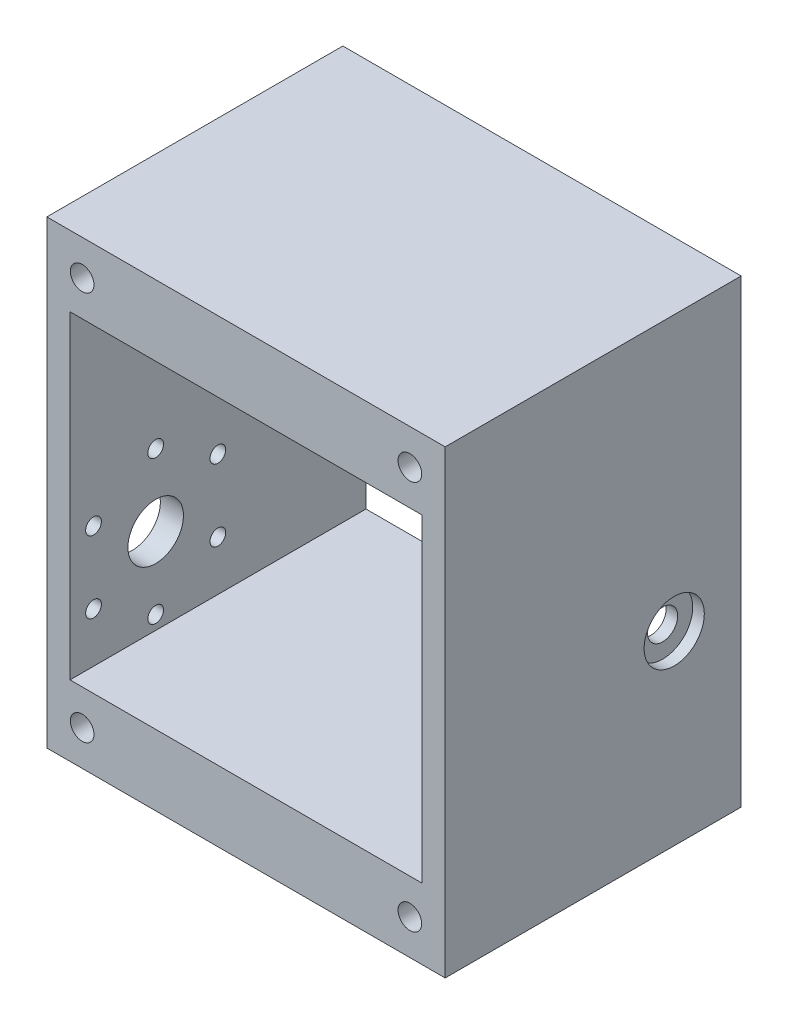
ISO-10303-21;
HEADER;
FILE_DESCRIPTION(('STEP AP214'),'2;1');
FILE_NAME('part.step','',(''),(''),'','','');
FILE_SCHEMA(('AUTOMOTIVE_DESIGN { 1 0 10303 214 1 1 1 1 }'));
ENDSEC;
DATA;
#1=APPLICATION_CONTEXT('core data for automotive mechanical design processes');
#2=APPLICATION_PROTOCOL_DEFINITION('international standard','automotive_design',2000,#1);
#3=PRODUCT_CONTEXT('',#1,'mechanical');
#4=PRODUCT('Part','Part','',(#3));
#5=PRODUCT_RELATED_PRODUCT_CATEGORY('part','',(#4));
#6=PRODUCT_DEFINITION_FORMATION('','',#4);
#7=PRODUCT_DEFINITION_CONTEXT('part definition',#1,'design');
#8=PRODUCT_DEFINITION('design','',#6,#7);
#9=PRODUCT_DEFINITION_SHAPE('','',#8);
#10=(LENGTH_UNIT() NAMED_UNIT(*) SI_UNIT(.MILLI.,.METRE.));
#11=(NAMED_UNIT(*) PLANE_ANGLE_UNIT() SI_UNIT($,.RADIAN.));
#12=(NAMED_UNIT(*) SI_UNIT($,.STERADIAN.) SOLID_ANGLE_UNIT());
#13=UNCERTAINTY_MEASURE_WITH_UNIT(LENGTH_MEASURE(1.E-05),#10,'distance_accuracy_value','');
#14=(GEOMETRIC_REPRESENTATION_CONTEXT(3) GLOBAL_UNCERTAINTY_ASSIGNED_CONTEXT((#13)) GLOBAL_UNIT_ASSIGNED_CONTEXT((#10,
#11,#12)) REPRESENTATION_CONTEXT('',''));
#15=CARTESIAN_POINT('',(0.,0.,0.));
#16=DIRECTION('',(0.,0.,1.));
#17=DIRECTION('',(1.,0.,0.));
#18=AXIS2_PLACEMENT_3D('',#15,#16,#17);
#19=CARTESIAN_POINT('',(42.999999852,-9.52499999999999,14.450199954));
#20=DIRECTION('',(1.,0.,0.));
#21=DIRECTION('',(0.,0.,-1.));
#22=AXIS2_PLACEMENT_3D('',#19,#20,#21);
#23=CYLINDRICAL_SURFACE('',#22,3.24999999999999);
#24=CARTESIAN_POINT('',(37.999999946,-9.52499999999999,14.450199954));
#25=DIRECTION('',(1.,0.,0.));
#26=DIRECTION('',(0.,0.,-1.));
#27=AXIS2_PLACEMENT_3D('',#24,#25,#26);
#28=CIRCLE('',#27,3.24999999999999);
#29=CARTESIAN_POINT('',(37.999999946,-9.52499999999999,11.200199954));
#30=VERTEX_POINT('',#29);
#31=EDGE_CURVE('E123',#30,#30,#28,.T.);
#32=ORIENTED_EDGE('',*,*,#31,.F.);
#33=EDGE_LOOP('',(#32));
#34=FACE_BOUND('',#33,.T.);
#35=CARTESIAN_POINT('',(40.499999899,-9.52499999999999,14.450199954));
#36=DIRECTION('',(1.,0.,0.));
#37=DIRECTION('',(0.,0.,-1.));
#38=AXIS2_PLACEMENT_3D('',#35,#36,#37);
#39=CIRCLE('',#38,3.24999999999999);
#40=CARTESIAN_POINT('',(40.499999899,-9.52499999999999,11.200199954));
#41=VERTEX_POINT('',#40);
#42=EDGE_CURVE('E37',#41,#41,#39,.F.);
#43=ORIENTED_EDGE('',*,*,#42,.F.);
#44=EDGE_LOOP('',(#43));
#45=FACE_BOUND('',#44,.T.);
#46=ADVANCED_FACE('F33',(#34,#45),#23,.F.);
#47=CARTESIAN_POINT('',(-42.999999852,-49.657,63.903125051));
#48=DIRECTION('',(1.,0.,0.));
#49=DIRECTION('',(0.,0.,-1.));
#50=AXIS2_PLACEMENT_3D('',#47,#48,#49);
#51=PLANE('',#50);
#52=DIRECTION('',(0.,-1.,0.));
#53=VECTOR('',#52,1.);
#54=CARTESIAN_POINT('',(-42.999999852,-49.657,0.));
#55=LINE('',#54,#53);
#56=CARTESIAN_POINT('',(-42.999999852,49.657,0.));
#57=VERTEX_POINT('',#56);
#58=CARTESIAN_POINT('',(-42.999999852,-49.657,0.));
#59=VERTEX_POINT('',#58);
#60=EDGE_CURVE('E154',#57,#59,#55,.T.);
#61=ORIENTED_EDGE('',*,*,#60,.T.);
#62=DIRECTION('',(0.,0.,-1.));
#63=VECTOR('',#62,1.);
#64=CARTESIAN_POINT('',(-42.999999852,-49.657,63.903125051));
#65=LINE('',#64,#63);
#66=CARTESIAN_POINT('',(-42.999999852,-49.657,63.903125051));
#67=VERTEX_POINT('',#66);
#68=EDGE_CURVE('E159',#67,#59,#65,.T.);
#69=ORIENTED_EDGE('',*,*,#68,.F.);
#70=DIRECTION('',(0.,-1.,0.));
#71=VECTOR('',#70,1.);
#72=CARTESIAN_POINT('',(-42.999999852,-49.657,63.903125051));
#73=LINE('',#72,#71);
#74=CARTESIAN_POINT('',(-42.999999852,49.657,63.903125051));
#75=VERTEX_POINT('',#74);
#76=EDGE_CURVE('E145',#75,#67,#73,.T.);
#77=ORIENTED_EDGE('',*,*,#76,.F.);
#78=DIRECTION('',(0.,0.,-1.));
#79=VECTOR('',#78,1.);
#80=CARTESIAN_POINT('',(-42.999999852,49.657,63.903125051));
#81=LINE('',#80,#79);
#82=EDGE_CURVE('E42',#75,#57,#81,.T.);
#83=ORIENTED_EDGE('',*,*,#82,.T.);
#84=EDGE_LOOP('',(#61,#69,#77,#83));
#85=FACE_BOUND('',#84,.T.);
#86=CARTESIAN_POINT('',(-42.999999852,-15.917000043,45.403125094));
#87=DIRECTION('',(-1.,0.,0.));
#88=DIRECTION('',(0.,0.,1.));
#89=AXIS2_PLACEMENT_3D('',#86,#87,#88);
#90=CIRCLE('',#89,6.);
#91=CARTESIAN_POINT('',(-42.999999852,-15.917000043,51.403125094));
#92=VERTEX_POINT('',#91);
#93=EDGE_CURVE('E299',#92,#92,#90,.T.);
#94=ORIENTED_EDGE('',*,*,#93,.F.);
#95=EDGE_LOOP('',(#94));
#96=FACE_BOUND('',#95,.T.);
#97=CARTESIAN_POINT('',(-42.999999852,-8.167000049,31.9797313457335));
#98=DIRECTION('',(-1.,0.,0.));
#99=DIRECTION('',(0.,0.,1.));
#100=AXIS2_PLACEMENT_3D('',#97,#98,#99);
#101=CIRCLE('',#100,3.15);
#102=CARTESIAN_POINT('',(-42.999999852,-8.167000049,35.1297313457335));
#103=VERTEX_POINT('',#102);
#104=EDGE_CURVE('E290',#103,#103,#101,.T.);
#105=ORIENTED_EDGE('',*,*,#104,.F.);
#106=EDGE_LOOP('',(#105));
#107=FACE_BOUND('',#106,.T.);
#108=CARTESIAN_POINT('',(-42.999999852,-23.667000037,31.9797313457335));
#109=DIRECTION('',(-1.,0.,0.));
#110=DIRECTION('',(0.,0.,1.));
#111=AXIS2_PLACEMENT_3D('',#108,#109,#110);
#112=CIRCLE('',#111,3.15);
#113=CARTESIAN_POINT('',(-42.999999852,-23.667000037,35.1297313457335));
#114=VERTEX_POINT('',#113);
#115=EDGE_CURVE('E281',#114,#114,#112,.T.);
#116=ORIENTED_EDGE('',*,*,#115,.F.);
#117=EDGE_LOOP('',(#116));
#118=FACE_BOUND('',#117,.T.);
#119=CARTESIAN_POINT('',(-42.999999852,-31.417000031,45.403125094));
#120=DIRECTION('',(-1.,0.,0.));
#121=DIRECTION('',(0.,0.,1.));
#122=AXIS2_PLACEMENT_3D('',#119,#120,#121);
#123=CIRCLE('',#122,3.15);
#124=CARTESIAN_POINT('',(-42.999999852,-31.417000031,48.553125094));
#125=VERTEX_POINT('',#124);
#126=EDGE_CURVE('E272',#125,#125,#123,.T.);
#127=ORIENTED_EDGE('',*,*,#126,.F.);
#128=EDGE_LOOP('',(#127));
#129=FACE_BOUND('',#128,.T.);
#130=CARTESIAN_POINT('',(-42.999999852,-23.667000037,58.8265188422665));
#131=DIRECTION('',(-1.,0.,0.));
#132=DIRECTION('',(0.,0.,1.));
#133=AXIS2_PLACEMENT_3D('',#130,#131,#132);
#134=CIRCLE('',#133,3.15);
#135=CARTESIAN_POINT('',(-42.999999852,-23.667000037,61.9765188422665));
#136=VERTEX_POINT('',#135);
#137=EDGE_CURVE('E263',#136,#136,#134,.T.);
#138=ORIENTED_EDGE('',*,*,#137,.F.);
#139=EDGE_LOOP('',(#138));
#140=FACE_BOUND('',#139,.T.);
#141=CARTESIAN_POINT('',(-42.999999852,-8.167000049,58.8265188422665));
#142=DIRECTION('',(-1.,0.,0.));
#143=DIRECTION('',(0.,0.,1.));
#144=AXIS2_PLACEMENT_3D('',#141,#142,#143);
#145=CIRCLE('',#144,3.15);
#146=CARTESIAN_POINT('',(-42.999999852,-8.167000049,61.9765188422665));
#147=VERTEX_POINT('',#146);
#148=EDGE_CURVE('E254',#147,#147,#145,.T.);
#149=ORIENTED_EDGE('',*,*,#148,.F.);
#150=EDGE_LOOP('',(#149));
#151=FACE_BOUND('',#150,.T.);
#152=CARTESIAN_POINT('',(-42.999999852,-0.417000055000004,45.403125094));
#153=DIRECTION('',(-1.,0.,0.));
#154=DIRECTION('',(0.,0.,1.));
#155=AXIS2_PLACEMENT_3D('',#152,#153,#154);
#156=CIRCLE('',#155,3.15);
#157=CARTESIAN_POINT('',(-42.999999852,-0.417000055000004,48.553125094));
#158=VERTEX_POINT('',#157);
#159=EDGE_CURVE('E239',#158,#158,#156,.T.);
#160=ORIENTED_EDGE('',*,*,#159,.F.);
#161=EDGE_LOOP('',(#160));
#162=FACE_BOUND('',#161,.T.);
#163=ADVANCED_FACE('F167',(#85,#96,#107,#118,#129,#140,#151,#162),#51,.F.);
#164=CARTESIAN_POINT('',(42.999999852,-49.657,63.903125051));
#165=DIRECTION('',(-1.,0.,0.));
#166=DIRECTION('',(0.,0.,1.));
#167=AXIS2_PLACEMENT_3D('',#164,#165,#166);
#168=PLANE('',#167);
#169=CARTESIAN_POINT('',(42.999999852,-9.52499999999999,14.450199954));
#170=DIRECTION('',(1.,0.,0.));
#171=DIRECTION('',(0.,0.,-1.));
#172=AXIS2_PLACEMENT_3D('',#169,#170,#171);
#173=CIRCLE('',#172,6.499999954);
#174=CARTESIAN_POINT('',(42.999999852,-9.52499999999999,7.9502));
#175=VERTEX_POINT('',#174);
#176=EDGE_CURVE('E520',#175,#175,#173,.T.);
#177=ORIENTED_EDGE('',*,*,#176,.F.);
#178=EDGE_LOOP('',(#177));
#179=FACE_BOUND('',#178,.T.);
#180=DIRECTION('',(0.,1.,0.));
#181=VECTOR('',#180,1.);
#182=CARTESIAN_POINT('',(42.999999852,-49.657,0.));
#183=LINE('',#182,#181);
#184=CARTESIAN_POINT('',(42.999999852,-49.657,0.));
#185=VERTEX_POINT('',#184);
#186=CARTESIAN_POINT('',(42.999999852,49.657,0.));
#187=VERTEX_POINT('',#186);
#188=EDGE_CURVE('E135',#185,#187,#183,.T.);
#189=ORIENTED_EDGE('',*,*,#188,.T.);
#190=DIRECTION('',(0.,0.,-1.));
#191=VECTOR('',#190,1.);
#192=CARTESIAN_POINT('',(42.999999852,49.657,63.903125051));
#193=LINE('',#192,#191);
#194=CARTESIAN_POINT('',(42.999999852,49.657,63.903125051));
#195=VERTEX_POINT('',#194);
#196=EDGE_CURVE('E11',#195,#187,#193,.T.);
#197=ORIENTED_EDGE('',*,*,#196,.F.);
#198=DIRECTION('',(0.,1.,0.));
#199=VECTOR('',#198,1.);
#200=CARTESIAN_POINT('',(42.999999852,-49.657,63.903125051));
#201=LINE('',#200,#199);
#202=CARTESIAN_POINT('',(42.999999852,-49.657,63.903125051));
#203=VERTEX_POINT('',#202);
#204=EDGE_CURVE('E139',#203,#195,#201,.T.);
#205=ORIENTED_EDGE('',*,*,#204,.F.);
#206=DIRECTION('',(0.,0.,-1.));
#207=VECTOR('',#206,1.);
#208=CARTESIAN_POINT('',(42.999999852,-49.657,63.903125051));
#209=LINE('',#208,#207);
#210=EDGE_CURVE('E149',#203,#185,#209,.T.);
#211=ORIENTED_EDGE('',*,*,#210,.T.);
#212=EDGE_LOOP('',(#189,#197,#205,#211));
#213=FACE_BOUND('',#212,.T.);
#214=ADVANCED_FACE('F35',(#179,#213),#168,.F.);
#215=CARTESIAN_POINT('',(-42.999999852,49.657,63.903125051));
#216=DIRECTION('',(0.,-1.,0.));
#217=DIRECTION('',(0.,0.,-1.));
#218=AXIS2_PLACEMENT_3D('',#215,#216,#217);
#219=PLANE('',#218);
#220=DIRECTION('',(-1.,0.,0.));
#221=VECTOR('',#220,1.);
#222=CARTESIAN_POINT('',(-42.999999852,49.657,0.));
#223=LINE('',#222,#221);
#224=EDGE_CURVE('E152',#187,#57,#223,.T.);
#225=ORIENTED_EDGE('',*,*,#224,.T.);
#226=ORIENTED_EDGE('',*,*,#82,.F.);
#227=DIRECTION('',(-1.,0.,0.));
#228=VECTOR('',#227,1.);
#229=CARTESIAN_POINT('',(-42.999999852,49.657,63.903125051));
#230=LINE('',#229,#228);
#231=EDGE_CURVE('E142',#195,#75,#230,.T.);
#232=ORIENTED_EDGE('',*,*,#231,.F.);
#233=ORIENTED_EDGE('',*,*,#196,.T.);
#234=EDGE_LOOP('',(#225,#226,#232,#233));
#235=FACE_BOUND('',#234,.T.);
#236=ADVANCED_FACE('F182',(#235),#219,.F.);
#237=CARTESIAN_POINT('',(-42.999999852,-49.657,63.903125051));
#238=DIRECTION('',(0.,1.,0.));
#239=DIRECTION('',(0.,0.,1.));
#240=AXIS2_PLACEMENT_3D('',#237,#238,#239);
#241=PLANE('',#240);
#242=DIRECTION('',(1.,0.,0.));
#243=VECTOR('',#242,1.);
#244=CARTESIAN_POINT('',(-42.999999852,-49.657,0.));
#245=LINE('',#244,#243);
#246=EDGE_CURVE('E143',#59,#185,#245,.T.);
#247=ORIENTED_EDGE('',*,*,#246,.T.);
#248=ORIENTED_EDGE('',*,*,#210,.F.);
#249=DIRECTION('',(1.,0.,0.));
#250=VECTOR('',#249,1.);
#251=CARTESIAN_POINT('',(-42.999999852,-49.657,63.903125051));
#252=LINE('',#251,#250);
#253=EDGE_CURVE('E147',#67,#203,#252,.T.);
#254=ORIENTED_EDGE('',*,*,#253,.F.);
#255=ORIENTED_EDGE('',*,*,#68,.T.);
#256=EDGE_LOOP('',(#247,#248,#254,#255));
#257=FACE_BOUND('',#256,.T.);
#258=ADVANCED_FACE('F175',(#257),#241,.F.);
#259=CARTESIAN_POINT('',(0.,0.,63.903125051));
#260=DIRECTION('',(0.,0.,-1.));
#261=DIRECTION('',(-1.,0.,0.));
#262=AXIS2_PLACEMENT_3D('',#259,#260,#261);
#263=PLANE('',#262);
#264=CARTESIAN_POINT('',(-35.379999852,42.037,63.903125051));
#265=DIRECTION('',(0.,0.,1.));
#266=DIRECTION('',(1.,0.,0.));
#267=AXIS2_PLACEMENT_3D('',#264,#265,#266);
#268=CIRCLE('',#267,2.55269999999999);
#269=CARTESIAN_POINT('',(-32.827299852,42.037,63.903125051));
#270=VERTEX_POINT('',#269);
#271=EDGE_CURVE('E524',#270,#270,#268,.T.);
#272=ORIENTED_EDGE('',*,*,#271,.F.);
#273=EDGE_LOOP('',(#272));
#274=FACE_BOUND('',#273,.T.);
#275=CARTESIAN_POINT('',(35.379999852,42.037,63.903125051));
#276=DIRECTION('',(0.,0.,1.));
#277=DIRECTION('',(1.,0.,0.));
#278=AXIS2_PLACEMENT_3D('',#275,#276,#277);
#279=CIRCLE('',#278,2.55269999999999);
#280=CARTESIAN_POINT('',(37.932699852,42.037,63.903125051));
#281=VERTEX_POINT('',#280);
#282=EDGE_CURVE('E528',#281,#281,#279,.T.);
#283=ORIENTED_EDGE('',*,*,#282,.F.);
#284=EDGE_LOOP('',(#283));
#285=FACE_BOUND('',#284,.T.);
#286=CARTESIAN_POINT('',(-35.379999852,-42.037,63.903125051));
#287=DIRECTION('',(0.,0.,1.));
#288=DIRECTION('',(1.,0.,0.));
#289=AXIS2_PLACEMENT_3D('',#286,#287,#288);
#290=CIRCLE('',#289,2.55269999999999);
#291=CARTESIAN_POINT('',(-32.827299852,-42.037,63.903125051));
#292=VERTEX_POINT('',#291);
#293=EDGE_CURVE('E532',#292,#292,#290,.T.);
#294=ORIENTED_EDGE('',*,*,#293,.F.);
#295=EDGE_LOOP('',(#294));
#296=FACE_BOUND('',#295,.T.);
#297=CARTESIAN_POINT('',(35.379999852,-42.037,63.903125051));
#298=DIRECTION('',(0.,0.,1.));
#299=DIRECTION('',(1.,0.,0.));
#300=AXIS2_PLACEMENT_3D('',#297,#298,#299);
#301=CIRCLE('',#300,2.55269999999999);
#302=CARTESIAN_POINT('',(37.932699852,-42.037,63.903125051));
#303=VERTEX_POINT('',#302);
#304=EDGE_CURVE('E240',#303,#303,#301,.T.);
#305=ORIENTED_EDGE('',*,*,#304,.F.);
#306=EDGE_LOOP('',(#305));
#307=FACE_BOUND('',#306,.T.);
#308=DIRECTION('',(-1.,0.,0.));
#309=VECTOR('',#308,1.);
#310=CARTESIAN_POINT('',(-37.999999946,34.417,63.903125051));
#311=LINE('',#310,#309);
#312=CARTESIAN_POINT('',(37.999999946,34.417,63.903125051));
#313=VERTEX_POINT('',#312);
#314=CARTESIAN_POINT('',(-37.999999946,34.417,63.903125051));
#315=VERTEX_POINT('',#314);
#316=EDGE_CURVE('E129',#313,#315,#311,.T.);
#317=ORIENTED_EDGE('',*,*,#316,.F.);
#318=DIRECTION('',(0.,1.,0.));
#319=VECTOR('',#318,1.);
#320=CARTESIAN_POINT('',(37.999999946,-34.417,63.903125051));
#321=LINE('',#320,#319);
#322=CARTESIAN_POINT('',(37.999999946,-34.417,63.903125051));
#323=VERTEX_POINT('',#322);
#324=EDGE_CURVE('E49',#323,#313,#321,.T.);
#325=ORIENTED_EDGE('',*,*,#324,.F.);
#326=DIRECTION('',(1.,0.,0.));
#327=VECTOR('',#326,1.);
#328=CARTESIAN_POINT('',(-37.999999946,-34.417,63.903125051));
#329=LINE('',#328,#327);
#330=CARTESIAN_POINT('',(-37.999999946,-34.417,63.903125051));
#331=VERTEX_POINT('',#330);
#332=EDGE_CURVE('E117',#331,#323,#329,.T.);
#333=ORIENTED_EDGE('',*,*,#332,.F.);
#334=DIRECTION('',(0.,-1.,0.));
#335=VECTOR('',#334,1.);
#336=CARTESIAN_POINT('',(-37.999999946,-34.417,63.903125051));
#337=LINE('',#336,#335);
#338=EDGE_CURVE('E120',#315,#331,#337,.T.);
#339=ORIENTED_EDGE('',*,*,#338,.F.);
#340=EDGE_LOOP('',(#317,#325,#333,#339));
#341=FACE_BOUND('',#340,.T.);
#342=ORIENTED_EDGE('',*,*,#204,.T.);
#343=ORIENTED_EDGE('',*,*,#231,.T.);
#344=ORIENTED_EDGE('',*,*,#76,.T.);
#345=ORIENTED_EDGE('',*,*,#253,.T.);
#346=EDGE_LOOP('',(#342,#343,#344,#345));
#347=FACE_BOUND('',#346,.T.);
#348=ADVANCED_FACE('F181',(#274,#285,#296,#307,#341,#347),#263,.F.);
#349=CARTESIAN_POINT('',(0.,0.,0.));
#350=DIRECTION('',(0.,0.,-1.));
#351=DIRECTION('',(-1.,0.,0.));
#352=AXIS2_PLACEMENT_3D('',#349,#350,#351);
#353=PLANE('',#352);
#354=CARTESIAN_POINT('',(-35.379999852,42.037,0.));
#355=DIRECTION('',(0.,0.,1.));
#356=DIRECTION('',(1.,0.,0.));
#357=AXIS2_PLACEMENT_3D('',#354,#355,#356);
#358=CIRCLE('',#357,2.55269999999998);
#359=CARTESIAN_POINT('',(-32.827299852,42.037,0.));
#360=VERTEX_POINT('',#359);
#361=EDGE_CURVE('E226',#360,#360,#358,.T.);
#362=ORIENTED_EDGE('',*,*,#361,.T.);
#363=EDGE_LOOP('',(#362));
#364=FACE_BOUND('',#363,.T.);
#365=CARTESIAN_POINT('',(35.379999852,42.037,0.));
#366=DIRECTION('',(0.,0.,1.));
#367=DIRECTION('',(1.,0.,0.));
#368=AXIS2_PLACEMENT_3D('',#365,#366,#367);
#369=CIRCLE('',#368,2.55269999999998);
#370=CARTESIAN_POINT('',(37.932699852,42.037,0.));
#371=VERTEX_POINT('',#370);
#372=EDGE_CURVE('E230',#371,#371,#369,.T.);
#373=ORIENTED_EDGE('',*,*,#372,.T.);
#374=EDGE_LOOP('',(#373));
#375=FACE_BOUND('',#374,.T.);
#376=CARTESIAN_POINT('',(-35.379999852,-42.037,0.));
#377=DIRECTION('',(0.,0.,1.));
#378=DIRECTION('',(1.,0.,0.));
#379=AXIS2_PLACEMENT_3D('',#376,#377,#378);
#380=CIRCLE('',#379,2.55269999999998);
#381=CARTESIAN_POINT('',(-32.827299852,-42.037,0.));
#382=VERTEX_POINT('',#381);
#383=EDGE_CURVE('E234',#382,#382,#380,.T.);
#384=ORIENTED_EDGE('',*,*,#383,.T.);
#385=EDGE_LOOP('',(#384));
#386=FACE_BOUND('',#385,.T.);
#387=CARTESIAN_POINT('',(35.379999852,-42.037,0.));
#388=DIRECTION('',(0.,0.,1.));
#389=DIRECTION('',(1.,0.,0.));
#390=AXIS2_PLACEMENT_3D('',#387,#388,#389);
#391=CIRCLE('',#390,2.55269999999998);
#392=CARTESIAN_POINT('',(37.932699852,-42.037,0.));
#393=VERTEX_POINT('',#392);
#394=EDGE_CURVE('E237',#393,#393,#391,.T.);
#395=ORIENTED_EDGE('',*,*,#394,.T.);
#396=EDGE_LOOP('',(#395));
#397=FACE_BOUND('',#396,.T.);
#398=DIRECTION('',(0.,1.,0.));
#399=VECTOR('',#398,1.);
#400=CARTESIAN_POINT('',(37.999999946,-34.417,0.));
#401=LINE('',#400,#399);
#402=CARTESIAN_POINT('',(37.999999946,-34.417,0.));
#403=VERTEX_POINT('',#402);
#404=CARTESIAN_POINT('',(37.999999946,34.417,0.));
#405=VERTEX_POINT('',#404);
#406=EDGE_CURVE('E101',#403,#405,#401,.T.);
#407=ORIENTED_EDGE('',*,*,#406,.T.);
#408=DIRECTION('',(-1.,0.,0.));
#409=VECTOR('',#408,1.);
#410=CARTESIAN_POINT('',(-37.999999946,34.417,0.));
#411=LINE('',#410,#409);
#412=CARTESIAN_POINT('',(-37.999999946,34.417,0.));
#413=VERTEX_POINT('',#412);
#414=EDGE_CURVE('E110',#405,#413,#411,.T.);
#415=ORIENTED_EDGE('',*,*,#414,.T.);
#416=DIRECTION('',(0.,-1.,0.));
#417=VECTOR('',#416,1.);
#418=CARTESIAN_POINT('',(-37.999999946,-34.417,0.));
#419=LINE('',#418,#417);
#420=CARTESIAN_POINT('',(-37.999999946,-34.417,0.));
#421=VERTEX_POINT('',#420);
#422=EDGE_CURVE('E57',#413,#421,#419,.T.);
#423=ORIENTED_EDGE('',*,*,#422,.T.);
#424=DIRECTION('',(1.,0.,0.));
#425=VECTOR('',#424,1.);
#426=CARTESIAN_POINT('',(-37.999999946,-34.417,0.));
#427=LINE('',#426,#425);
#428=EDGE_CURVE('E107',#421,#403,#427,.T.);
#429=ORIENTED_EDGE('',*,*,#428,.T.);
#430=EDGE_LOOP('',(#407,#415,#423,#429));
#431=FACE_BOUND('',#430,.T.);
#432=ORIENTED_EDGE('',*,*,#188,.F.);
#433=ORIENTED_EDGE('',*,*,#246,.F.);
#434=ORIENTED_EDGE('',*,*,#60,.F.);
#435=ORIENTED_EDGE('',*,*,#224,.F.);
#436=EDGE_LOOP('',(#432,#433,#434,#435));
#437=FACE_BOUND('',#436,.T.);
#438=ADVANCED_FACE('F114',(#364,#375,#386,#397,#431,#437),#353,.T.);
#439=CARTESIAN_POINT('',(37.999999946,-34.417,0.));
#440=DIRECTION('',(1.,0.,0.));
#441=DIRECTION('',(0.,0.,-1.));
#442=AXIS2_PLACEMENT_3D('',#439,#440,#441);
#443=PLANE('',#442);
#444=ORIENTED_EDGE('',*,*,#31,.T.);
#445=EDGE_LOOP('',(#444));
#446=FACE_BOUND('',#445,.T.);
#447=ORIENTED_EDGE('',*,*,#324,.T.);
#448=DIRECTION('',(0.,0.,1.));
#449=VECTOR('',#448,1.);
#450=CARTESIAN_POINT('',(37.999999946,34.417,0.));
#451=LINE('',#450,#449);
#452=EDGE_CURVE('E97',#405,#313,#451,.T.);
#453=ORIENTED_EDGE('',*,*,#452,.F.);
#454=ORIENTED_EDGE('',*,*,#406,.F.);
#455=DIRECTION('',(0.,0.,1.));
#456=VECTOR('',#455,1.);
#457=CARTESIAN_POINT('',(37.999999946,-34.417,0.));
#458=LINE('',#457,#456);
#459=EDGE_CURVE('E133',#403,#323,#458,.T.);
#460=ORIENTED_EDGE('',*,*,#459,.T.);
#461=EDGE_LOOP('',(#447,#453,#454,#460));
#462=FACE_BOUND('',#461,.T.);
#463=ADVANCED_FACE('F99',(#446,#462),#443,.F.);
#464=CARTESIAN_POINT('',(-37.999999946,-34.417,0.));
#465=DIRECTION('',(0.,-1.,0.));
#466=DIRECTION('',(0.,0.,-1.));
#467=AXIS2_PLACEMENT_3D('',#464,#465,#466);
#468=PLANE('',#467);
#469=ORIENTED_EDGE('',*,*,#332,.T.);
#470=ORIENTED_EDGE('',*,*,#459,.F.);
#471=ORIENTED_EDGE('',*,*,#428,.F.);
#472=DIRECTION('',(0.,0.,1.));
#473=VECTOR('',#472,1.);
#474=CARTESIAN_POINT('',(-37.999999946,-34.417,0.));
#475=LINE('',#474,#473);
#476=EDGE_CURVE('E136',#421,#331,#475,.T.);
#477=ORIENTED_EDGE('',*,*,#476,.T.);
#478=EDGE_LOOP('',(#469,#470,#471,#477));
#479=FACE_BOUND('',#478,.T.);
#480=ADVANCED_FACE('F203',(#479),#468,.F.);
#481=CARTESIAN_POINT('',(-37.999999946,-34.417,0.));
#482=DIRECTION('',(-1.,0.,0.));
#483=DIRECTION('',(0.,0.,1.));
#484=AXIS2_PLACEMENT_3D('',#481,#482,#483);
#485=PLANE('',#484);
#486=CARTESIAN_POINT('',(-37.999999946,-0.417000055000004,45.403125094));
#487=DIRECTION('',(-1.,0.,0.));
#488=DIRECTION('',(0.,0.,1.));
#489=AXIS2_PLACEMENT_3D('',#486,#487,#488);
#490=CIRCLE('',#489,1.7);
#491=CARTESIAN_POINT('',(-37.999999946,-0.417000055000004,47.103125094));
#492=VERTEX_POINT('',#491);
#493=EDGE_CURVE('E251',#492,#492,#490,.T.);
#494=ORIENTED_EDGE('',*,*,#493,.T.);
#495=EDGE_LOOP('',(#494));
#496=FACE_BOUND('',#495,.T.);
#497=CARTESIAN_POINT('',(-37.999999946,-8.167000049,58.8265188422665));
#498=DIRECTION('',(-1.,0.,0.));
#499=DIRECTION('',(0.,0.,1.));
#500=AXIS2_PLACEMENT_3D('',#497,#498,#499);
#501=CIRCLE('',#500,1.7);
#502=CARTESIAN_POINT('',(-37.999999946,-8.167000049,60.5265188422665));
#503=VERTEX_POINT('',#502);
#504=EDGE_CURVE('E260',#503,#503,#501,.T.);
#505=ORIENTED_EDGE('',*,*,#504,.T.);
#506=EDGE_LOOP('',(#505));
#507=FACE_BOUND('',#506,.T.);
#508=CARTESIAN_POINT('',(-37.999999946,-23.667000037,58.8265188422665));
#509=DIRECTION('',(-1.,0.,0.));
#510=DIRECTION('',(0.,0.,1.));
#511=AXIS2_PLACEMENT_3D('',#508,#509,#510);
#512=CIRCLE('',#511,1.7);
#513=CARTESIAN_POINT('',(-37.999999946,-23.667000037,60.5265188422665));
#514=VERTEX_POINT('',#513);
#515=EDGE_CURVE('E269',#514,#514,#512,.T.);
#516=ORIENTED_EDGE('',*,*,#515,.T.);
#517=EDGE_LOOP('',(#516));
#518=FACE_BOUND('',#517,.T.);
#519=CARTESIAN_POINT('',(-37.999999946,-31.417000031,45.403125094));
#520=DIRECTION('',(-1.,0.,0.));
#521=DIRECTION('',(0.,0.,1.));
#522=AXIS2_PLACEMENT_3D('',#519,#520,#521);
#523=CIRCLE('',#522,1.7);
#524=CARTESIAN_POINT('',(-37.999999946,-31.417000031,47.103125094));
#525=VERTEX_POINT('',#524);
#526=EDGE_CURVE('E278',#525,#525,#523,.T.);
#527=ORIENTED_EDGE('',*,*,#526,.T.);
#528=EDGE_LOOP('',(#527));
#529=FACE_BOUND('',#528,.T.);
#530=CARTESIAN_POINT('',(-37.999999946,-23.667000037,31.9797313457335));
#531=DIRECTION('',(-1.,0.,0.));
#532=DIRECTION('',(0.,0.,1.));
#533=AXIS2_PLACEMENT_3D('',#530,#531,#532);
#534=CIRCLE('',#533,1.7);
#535=CARTESIAN_POINT('',(-37.999999946,-23.667000037,33.6797313457335));
#536=VERTEX_POINT('',#535);
#537=EDGE_CURVE('E287',#536,#536,#534,.T.);
#538=ORIENTED_EDGE('',*,*,#537,.T.);
#539=EDGE_LOOP('',(#538));
#540=FACE_BOUND('',#539,.T.);
#541=CARTESIAN_POINT('',(-37.999999946,-8.167000049,31.9797313457335));
#542=DIRECTION('',(-1.,0.,0.));
#543=DIRECTION('',(0.,0.,1.));
#544=AXIS2_PLACEMENT_3D('',#541,#542,#543);
#545=CIRCLE('',#544,1.7);
#546=CARTESIAN_POINT('',(-37.999999946,-8.167000049,33.6797313457335));
#547=VERTEX_POINT('',#546);
#548=EDGE_CURVE('E296',#547,#547,#545,.T.);
#549=ORIENTED_EDGE('',*,*,#548,.T.);
#550=EDGE_LOOP('',(#549));
#551=FACE_BOUND('',#550,.T.);
#552=CARTESIAN_POINT('',(-37.999999946,-15.917000043,45.403125094));
#553=DIRECTION('',(-1.,0.,0.));
#554=DIRECTION('',(0.,0.,1.));
#555=AXIS2_PLACEMENT_3D('',#552,#553,#554);
#556=CIRCLE('',#555,6.);
#557=CARTESIAN_POINT('',(-37.999999946,-15.917000043,51.403125094));
#558=VERTEX_POINT('',#557);
#559=EDGE_CURVE('E301',#558,#558,#556,.T.);
#560=ORIENTED_EDGE('',*,*,#559,.T.);
#561=EDGE_LOOP('',(#560));
#562=FACE_BOUND('',#561,.T.);
#563=ORIENTED_EDGE('',*,*,#338,.T.);
#564=ORIENTED_EDGE('',*,*,#476,.F.);
#565=ORIENTED_EDGE('',*,*,#422,.F.);
#566=DIRECTION('',(0.,0.,1.));
#567=VECTOR('',#566,1.);
#568=CARTESIAN_POINT('',(-37.999999946,34.417,0.));
#569=LINE('',#568,#567);
#570=EDGE_CURVE('E106',#413,#315,#569,.T.);
#571=ORIENTED_EDGE('',*,*,#570,.T.);
#572=EDGE_LOOP('',(#563,#564,#565,#571));
#573=FACE_BOUND('',#572,.T.);
#574=ADVANCED_FACE('F206',(#496,#507,#518,#529,#540,#551,#562,#573),#485,.F.);
#575=CARTESIAN_POINT('',(-37.999999946,34.417,0.));
#576=DIRECTION('',(0.,1.,0.));
#577=DIRECTION('',(0.,0.,1.));
#578=AXIS2_PLACEMENT_3D('',#575,#576,#577);
#579=PLANE('',#578);
#580=ORIENTED_EDGE('',*,*,#316,.T.);
#581=ORIENTED_EDGE('',*,*,#570,.F.);
#582=ORIENTED_EDGE('',*,*,#414,.F.);
#583=ORIENTED_EDGE('',*,*,#452,.T.);
#584=EDGE_LOOP('',(#580,#581,#582,#583));
#585=FACE_BOUND('',#584,.T.);
#586=ADVANCED_FACE('F111',(#585),#579,.F.);
#587=CARTESIAN_POINT('',(-42.999999852,-15.917000043,45.403125094));
#588=DIRECTION('',(-1.,0.,0.));
#589=DIRECTION('',(0.,0.,1.));
#590=AXIS2_PLACEMENT_3D('',#587,#588,#589);
#591=CYLINDRICAL_SURFACE('',#590,6.);
#592=ORIENTED_EDGE('',*,*,#559,.F.);
#593=EDGE_LOOP('',(#592));
#594=FACE_BOUND('',#593,.T.);
#595=ORIENTED_EDGE('',*,*,#93,.T.);
#596=EDGE_LOOP('',(#595));
#597=FACE_BOUND('',#596,.T.);
#598=ADVANCED_FACE('F201',(#594,#597),#591,.F.);
#599=CARTESIAN_POINT('',(-42.999999852,-8.167000049,31.9797313457335));
#600=DIRECTION('',(-1.,0.,0.));
#601=DIRECTION('',(0.,0.,1.));
#602=AXIS2_PLACEMENT_3D('',#599,#600,#601);
#603=CYLINDRICAL_SURFACE('',#602,1.7);
#604=ORIENTED_EDGE('',*,*,#548,.F.);
#605=EDGE_LOOP('',(#604));
#606=FACE_BOUND('',#605,.T.);
#607=CARTESIAN_POINT('',(-41.549999852,-8.167000049,31.9797313457335));
#608=DIRECTION('',(-1.,0.,0.));
#609=DIRECTION('',(0.,0.,1.));
#610=AXIS2_PLACEMENT_3D('',#607,#608,#609);
#611=CIRCLE('',#610,1.7);
#612=CARTESIAN_POINT('',(-41.549999852,-8.167000049,33.6797313457335));
#613=VERTEX_POINT('',#612);
#614=EDGE_CURVE('E293',#613,#613,#611,.T.);
#615=ORIENTED_EDGE('',*,*,#614,.T.);
#616=EDGE_LOOP('',(#615));
#617=FACE_BOUND('',#616,.T.);
#618=ADVANCED_FACE('F309',(#606,#617),#603,.F.);
#619=CARTESIAN_POINT('',(-42.999999852,-8.167000049,31.9797313457335));
#620=DIRECTION('',(-1.,0.,0.));
#621=DIRECTION('',(0.,0.,1.));
#622=AXIS2_PLACEMENT_3D('',#619,#620,#621);
#623=CONICAL_SURFACE('',#622,3.15,0.785398163397449);
#624=ORIENTED_EDGE('',*,*,#614,.F.);
#625=EDGE_LOOP('',(#624));
#626=FACE_BOUND('',#625,.T.);
#627=ORIENTED_EDGE('',*,*,#104,.T.);
#628=EDGE_LOOP('',(#627));
#629=FACE_BOUND('',#628,.T.);
#630=ADVANCED_FACE('F372',(#626,#629),#623,.F.);
#631=CARTESIAN_POINT('',(-42.999999852,-23.667000037,31.9797313457335));
#632=DIRECTION('',(-1.,0.,0.));
#633=DIRECTION('',(0.,0.,1.));
#634=AXIS2_PLACEMENT_3D('',#631,#632,#633);
#635=CYLINDRICAL_SURFACE('',#634,1.7);
#636=ORIENTED_EDGE('',*,*,#537,.F.);
#637=EDGE_LOOP('',(#636));
#638=FACE_BOUND('',#637,.T.);
#639=CARTESIAN_POINT('',(-41.549999852,-23.667000037,31.9797313457335));
#640=DIRECTION('',(-1.,0.,0.));
#641=DIRECTION('',(0.,0.,1.));
#642=AXIS2_PLACEMENT_3D('',#639,#640,#641);
#643=CIRCLE('',#642,1.7);
#644=CARTESIAN_POINT('',(-41.549999852,-23.667000037,33.6797313457335));
#645=VERTEX_POINT('',#644);
#646=EDGE_CURVE('E284',#645,#645,#643,.T.);
#647=ORIENTED_EDGE('',*,*,#646,.T.);
#648=EDGE_LOOP('',(#647));
#649=FACE_BOUND('',#648,.T.);
#650=ADVANCED_FACE('F368',(#638,#649),#635,.F.);
#651=CARTESIAN_POINT('',(-42.999999852,-23.667000037,31.9797313457335));
#652=DIRECTION('',(-1.,0.,0.));
#653=DIRECTION('',(0.,0.,1.));
#654=AXIS2_PLACEMENT_3D('',#651,#652,#653);
#655=CONICAL_SURFACE('',#654,3.15,0.785398163397448);
#656=ORIENTED_EDGE('',*,*,#646,.F.);
#657=EDGE_LOOP('',(#656));
#658=FACE_BOUND('',#657,.T.);
#659=ORIENTED_EDGE('',*,*,#115,.T.);
#660=EDGE_LOOP('',(#659));
#661=FACE_BOUND('',#660,.T.);
#662=ADVANCED_FACE('F364',(#658,#661),#655,.F.);
#663=CARTESIAN_POINT('',(-42.999999852,-31.417000031,45.403125094));
#664=DIRECTION('',(-1.,0.,0.));
#665=DIRECTION('',(0.,0.,1.));
#666=AXIS2_PLACEMENT_3D('',#663,#664,#665);
#667=CYLINDRICAL_SURFACE('',#666,1.7);
#668=ORIENTED_EDGE('',*,*,#526,.F.);
#669=EDGE_LOOP('',(#668));
#670=FACE_BOUND('',#669,.T.);
#671=CARTESIAN_POINT('',(-41.549999852,-31.417000031,45.403125094));
#672=DIRECTION('',(-1.,0.,0.));
#673=DIRECTION('',(0.,0.,1.));
#674=AXIS2_PLACEMENT_3D('',#671,#672,#673);
#675=CIRCLE('',#674,1.7);
#676=CARTESIAN_POINT('',(-41.549999852,-31.417000031,47.103125094));
#677=VERTEX_POINT('',#676);
#678=EDGE_CURVE('E275',#677,#677,#675,.T.);
#679=ORIENTED_EDGE('',*,*,#678,.T.);
#680=EDGE_LOOP('',(#679));
#681=FACE_BOUND('',#680,.T.);
#682=ADVANCED_FACE('F360',(#670,#681),#667,.F.);
#683=CARTESIAN_POINT('',(-42.999999852,-31.417000031,45.403125094));
#684=DIRECTION('',(-1.,0.,0.));
#685=DIRECTION('',(0.,0.,1.));
#686=AXIS2_PLACEMENT_3D('',#683,#684,#685);
#687=CONICAL_SURFACE('',#686,3.15,0.785398163397448);
#688=ORIENTED_EDGE('',*,*,#678,.F.);
#689=EDGE_LOOP('',(#688));
#690=FACE_BOUND('',#689,.T.);
#691=ORIENTED_EDGE('',*,*,#126,.T.);
#692=EDGE_LOOP('',(#691));
#693=FACE_BOUND('',#692,.T.);
#694=ADVANCED_FACE('F356',(#690,#693),#687,.F.);
#695=CARTESIAN_POINT('',(-42.999999852,-23.667000037,58.8265188422665));
#696=DIRECTION('',(-1.,0.,0.));
#697=DIRECTION('',(0.,0.,1.));
#698=AXIS2_PLACEMENT_3D('',#695,#696,#697);
#699=CYLINDRICAL_SURFACE('',#698,1.7);
#700=ORIENTED_EDGE('',*,*,#515,.F.);
#701=EDGE_LOOP('',(#700));
#702=FACE_BOUND('',#701,.T.);
#703=CARTESIAN_POINT('',(-41.549999852,-23.667000037,58.8265188422665));
#704=DIRECTION('',(-1.,0.,0.));
#705=DIRECTION('',(0.,0.,1.));
#706=AXIS2_PLACEMENT_3D('',#703,#704,#705);
#707=CIRCLE('',#706,1.7);
#708=CARTESIAN_POINT('',(-41.549999852,-23.667000037,60.5265188422665));
#709=VERTEX_POINT('',#708);
#710=EDGE_CURVE('E266',#709,#709,#707,.T.);
#711=ORIENTED_EDGE('',*,*,#710,.T.);
#712=EDGE_LOOP('',(#711));
#713=FACE_BOUND('',#712,.T.);
#714=ADVANCED_FACE('F352',(#702,#713),#699,.F.);
#715=CARTESIAN_POINT('',(-42.999999852,-23.667000037,58.8265188422665));
#716=DIRECTION('',(-1.,0.,0.));
#717=DIRECTION('',(0.,0.,1.));
#718=AXIS2_PLACEMENT_3D('',#715,#716,#717);
#719=CONICAL_SURFACE('',#718,3.15,0.785398163397448);
#720=ORIENTED_EDGE('',*,*,#710,.F.);
#721=EDGE_LOOP('',(#720));
#722=FACE_BOUND('',#721,.T.);
#723=ORIENTED_EDGE('',*,*,#137,.T.);
#724=EDGE_LOOP('',(#723));
#725=FACE_BOUND('',#724,.T.);
#726=ADVANCED_FACE('F348',(#722,#725),#719,.F.);
#727=CARTESIAN_POINT('',(-42.999999852,-8.167000049,58.8265188422665));
#728=DIRECTION('',(-1.,0.,0.));
#729=DIRECTION('',(0.,0.,1.));
#730=AXIS2_PLACEMENT_3D('',#727,#728,#729);
#731=CYLINDRICAL_SURFACE('',#730,1.7);
#732=ORIENTED_EDGE('',*,*,#504,.F.);
#733=EDGE_LOOP('',(#732));
#734=FACE_BOUND('',#733,.T.);
#735=CARTESIAN_POINT('',(-41.549999852,-8.167000049,58.8265188422665));
#736=DIRECTION('',(-1.,0.,0.));
#737=DIRECTION('',(0.,0.,1.));
#738=AXIS2_PLACEMENT_3D('',#735,#736,#737);
#739=CIRCLE('',#738,1.7);
#740=CARTESIAN_POINT('',(-41.549999852,-8.167000049,60.5265188422665));
#741=VERTEX_POINT('',#740);
#742=EDGE_CURVE('E257',#741,#741,#739,.T.);
#743=ORIENTED_EDGE('',*,*,#742,.T.);
#744=EDGE_LOOP('',(#743));
#745=FACE_BOUND('',#744,.T.);
#746=ADVANCED_FACE('F344',(#734,#745),#731,.F.);
#747=CARTESIAN_POINT('',(-42.999999852,-8.167000049,58.8265188422665));
#748=DIRECTION('',(-1.,0.,0.));
#749=DIRECTION('',(0.,0.,1.));
#750=AXIS2_PLACEMENT_3D('',#747,#748,#749);
#751=CONICAL_SURFACE('',#750,3.15,0.785398163397449);
#752=ORIENTED_EDGE('',*,*,#742,.F.);
#753=EDGE_LOOP('',(#752));
#754=FACE_BOUND('',#753,.T.);
#755=ORIENTED_EDGE('',*,*,#148,.T.);
#756=EDGE_LOOP('',(#755));
#757=FACE_BOUND('',#756,.T.);
#758=ADVANCED_FACE('F336',(#754,#757),#751,.F.);
#759=CARTESIAN_POINT('',(-42.999999852,-0.417000055000004,45.403125094));
#760=DIRECTION('',(-1.,0.,0.));
#761=DIRECTION('',(0.,0.,1.));
#762=AXIS2_PLACEMENT_3D('',#759,#760,#761);
#763=CYLINDRICAL_SURFACE('',#762,1.7);
#764=ORIENTED_EDGE('',*,*,#493,.F.);
#765=EDGE_LOOP('',(#764));
#766=FACE_BOUND('',#765,.T.);
#767=CARTESIAN_POINT('',(-41.549999852,-0.417000055000004,45.403125094));
#768=DIRECTION('',(-1.,0.,0.));
#769=DIRECTION('',(0.,0.,1.));
#770=AXIS2_PLACEMENT_3D('',#767,#768,#769);
#771=CIRCLE('',#770,1.7);
#772=CARTESIAN_POINT('',(-41.549999852,-0.417000055000004,47.103125094));
#773=VERTEX_POINT('',#772);
#774=EDGE_CURVE('E243',#773,#773,#771,.T.);
#775=ORIENTED_EDGE('',*,*,#774,.T.);
#776=EDGE_LOOP('',(#775));
#777=FACE_BOUND('',#776,.T.);
#778=ADVANCED_FACE('F327',(#766,#777),#763,.F.);
#779=CARTESIAN_POINT('',(-42.999999852,-0.417000055000004,45.403125094));
#780=DIRECTION('',(-1.,0.,0.));
#781=DIRECTION('',(0.,0.,1.));
#782=AXIS2_PLACEMENT_3D('',#779,#780,#781);
#783=CONICAL_SURFACE('',#782,3.15,0.785398163397449);
#784=ORIENTED_EDGE('',*,*,#774,.F.);
#785=EDGE_LOOP('',(#784));
#786=FACE_BOUND('',#785,.T.);
#787=ORIENTED_EDGE('',*,*,#159,.T.);
#788=EDGE_LOOP('',(#787));
#789=FACE_BOUND('',#788,.T.);
#790=ADVANCED_FACE('F324',(#786,#789),#783,.F.);
#791=CARTESIAN_POINT('',(35.379999852,-42.037,63.903125051));
#792=DIRECTION('',(0.,0.,1.));
#793=DIRECTION('',(1.,0.,0.));
#794=AXIS2_PLACEMENT_3D('',#791,#792,#793);
#795=CYLINDRICAL_SURFACE('',#794,2.55269999999999);
#796=ORIENTED_EDGE('',*,*,#394,.F.);
#797=EDGE_LOOP('',(#796));
#798=FACE_BOUND('',#797,.T.);
#799=ORIENTED_EDGE('',*,*,#304,.T.);
#800=EDGE_LOOP('',(#799));
#801=FACE_BOUND('',#800,.T.);
#802=ADVANCED_FACE('F326',(#798,#801),#795,.F.);
#803=CARTESIAN_POINT('',(-35.379999852,-42.037,63.903125051));
#804=DIRECTION('',(0.,0.,1.));
#805=DIRECTION('',(1.,0.,0.));
#806=AXIS2_PLACEMENT_3D('',#803,#804,#805);
#807=CYLINDRICAL_SURFACE('',#806,2.55269999999999);
#808=ORIENTED_EDGE('',*,*,#383,.F.);
#809=EDGE_LOOP('',(#808));
#810=FACE_BOUND('',#809,.T.);
#811=ORIENTED_EDGE('',*,*,#293,.T.);
#812=EDGE_LOOP('',(#811));
#813=FACE_BOUND('',#812,.T.);
#814=ADVANCED_FACE('F334',(#810,#813),#807,.F.);
#815=CARTESIAN_POINT('',(35.379999852,42.037,63.903125051));
#816=DIRECTION('',(0.,0.,1.));
#817=DIRECTION('',(1.,0.,0.));
#818=AXIS2_PLACEMENT_3D('',#815,#816,#817);
#819=CYLINDRICAL_SURFACE('',#818,2.55269999999999);
#820=ORIENTED_EDGE('',*,*,#372,.F.);
#821=EDGE_LOOP('',(#820));
#822=FACE_BOUND('',#821,.T.);
#823=ORIENTED_EDGE('',*,*,#282,.T.);
#824=EDGE_LOOP('',(#823));
#825=FACE_BOUND('',#824,.T.);
#826=ADVANCED_FACE('F459',(#822,#825),#819,.F.);
#827=CARTESIAN_POINT('',(-35.379999852,42.037,63.903125051));
#828=DIRECTION('',(0.,0.,1.));
#829=DIRECTION('',(1.,0.,0.));
#830=AXIS2_PLACEMENT_3D('',#827,#828,#829);
#831=CYLINDRICAL_SURFACE('',#830,2.55269999999999);
#832=ORIENTED_EDGE('',*,*,#361,.F.);
#833=EDGE_LOOP('',(#832));
#834=FACE_BOUND('',#833,.T.);
#835=ORIENTED_EDGE('',*,*,#271,.T.);
#836=EDGE_LOOP('',(#835));
#837=FACE_BOUND('',#836,.T.);
#838=ADVANCED_FACE('F468',(#834,#837),#831,.F.);
#839=CARTESIAN_POINT('',(40.499999899,-9.52499999999999,14.450199954));
#840=DIRECTION('',(1.,0.,0.));
#841=DIRECTION('',(0.,0.,-1.));
#842=AXIS2_PLACEMENT_3D('',#839,#840,#841);
#843=PLANE('',#842);
#844=CARTESIAN_POINT('',(40.499999899,-9.52499999999999,14.450199954));
#845=DIRECTION('',(1.,0.,0.));
#846=DIRECTION('',(0.,0.,-1.));
#847=AXIS2_PLACEMENT_3D('',#844,#845,#846);
#848=CIRCLE('',#847,6.499999954);
#849=CARTESIAN_POINT('',(40.499999899,-9.52499999999999,7.9502));
#850=VERTEX_POINT('',#849);
#851=EDGE_CURVE('E517',#850,#850,#848,.T.);
#852=ORIENTED_EDGE('',*,*,#851,.T.);
#853=EDGE_LOOP('',(#852));
#854=FACE_BOUND('',#853,.T.);
#855=ORIENTED_EDGE('',*,*,#42,.T.);
#856=EDGE_LOOP('',(#855));
#857=FACE_BOUND('',#856,.T.);
#858=ADVANCED_FACE('F477',(#854,#857),#843,.T.);
#859=CARTESIAN_POINT('',(40.499999899,-9.52499999999999,14.450199954));
#860=DIRECTION('',(1.,0.,0.));
#861=DIRECTION('',(0.,0.,-1.));
#862=AXIS2_PLACEMENT_3D('',#859,#860,#861);
#863=CYLINDRICAL_SURFACE('',#862,6.499999954);
#864=ORIENTED_EDGE('',*,*,#851,.F.);
#865=EDGE_LOOP('',(#864));
#866=FACE_BOUND('',#865,.T.);
#867=ORIENTED_EDGE('',*,*,#176,.T.);
#868=EDGE_LOOP('',(#867));
#869=FACE_BOUND('',#868,.T.);
#870=ADVANCED_FACE('F500',(#866,#869),#863,.F.);
#871=CLOSED_SHELL('',(#46,#163,#214,#236,#258,#348,#438,#463,#480,#574,#586,#598,#618,#630,#650,
#662,#682,#694,#714,#726,#746,#758,#778,#790,#802,#814,#826,#838,#858,#870));
#872=MANIFOLD_SOLID_BREP('B2',#871);
#873=ADVANCED_BREP_SHAPE_REPRESENTATION('',(#18,#872),#14);
#874=SHAPE_DEFINITION_REPRESENTATION(#9,#873);
ENDSEC;
END-ISO-10303-21;
